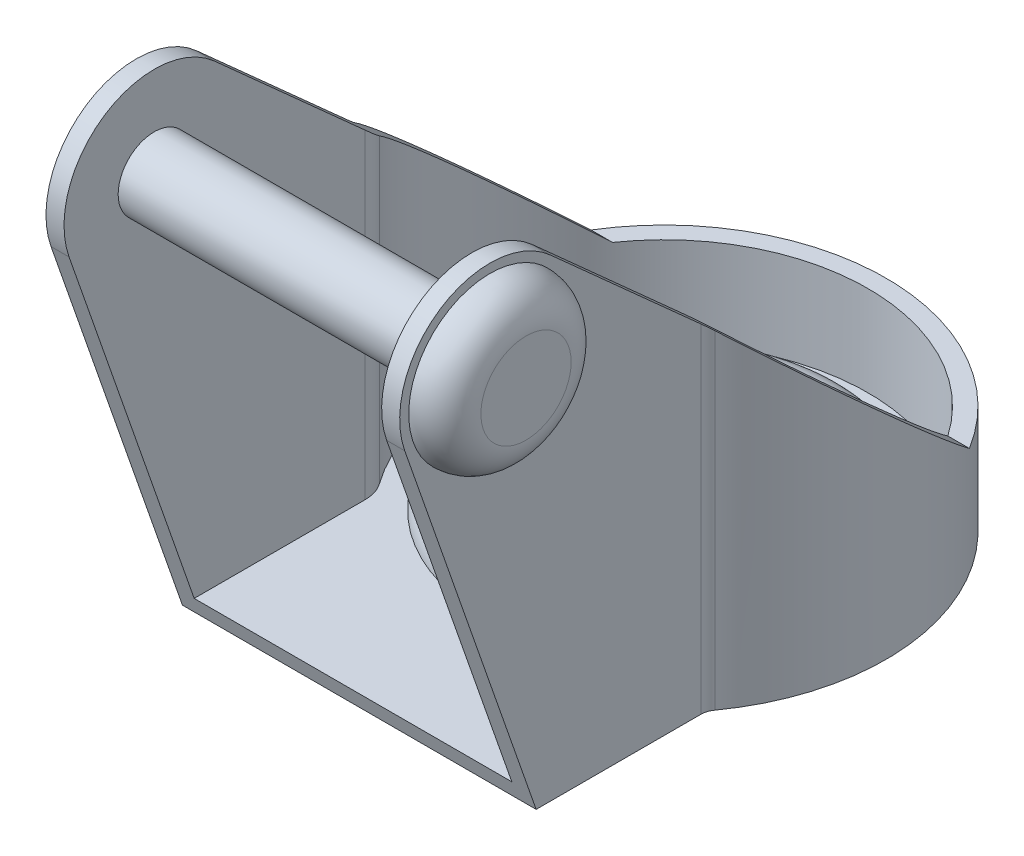
ISO-10303-21;
HEADER;
FILE_DESCRIPTION(('STEP AP214'),'2;1');
FILE_NAME('part.step','',(''),(''),'','','');
FILE_SCHEMA(('AUTOMOTIVE_DESIGN { 1 0 10303 214 1 1 1 1 }'));
ENDSEC;
DATA;
#1=APPLICATION_CONTEXT('core data for automotive mechanical design processes');
#2=APPLICATION_PROTOCOL_DEFINITION('international standard','automotive_design',2000,#1);
#3=PRODUCT_CONTEXT('',#1,'mechanical');
#4=PRODUCT('Part','Part','',(#3));
#5=PRODUCT_RELATED_PRODUCT_CATEGORY('part','',(#4));
#6=PRODUCT_DEFINITION_FORMATION('','',#4);
#7=PRODUCT_DEFINITION_CONTEXT('part definition',#1,'design');
#8=PRODUCT_DEFINITION('design','',#6,#7);
#9=PRODUCT_DEFINITION_SHAPE('','',#8);
#10=(LENGTH_UNIT() NAMED_UNIT(*) SI_UNIT(.MILLI.,.METRE.));
#11=(NAMED_UNIT(*) PLANE_ANGLE_UNIT() SI_UNIT($,.RADIAN.));
#12=(NAMED_UNIT(*) SI_UNIT($,.STERADIAN.) SOLID_ANGLE_UNIT());
#13=UNCERTAINTY_MEASURE_WITH_UNIT(LENGTH_MEASURE(1.E-05),#10,'distance_accuracy_value','');
#14=(GEOMETRIC_REPRESENTATION_CONTEXT(3) GLOBAL_UNCERTAINTY_ASSIGNED_CONTEXT((#13)) GLOBAL_UNIT_ASSIGNED_CONTEXT((#10,
#11,#12)) REPRESENTATION_CONTEXT('',''));
#15=CARTESIAN_POINT('',(0.,0.,0.));
#16=DIRECTION('',(0.,0.,1.));
#17=DIRECTION('',(1.,0.,0.));
#18=AXIS2_PLACEMENT_3D('',#15,#16,#17);
#19=CARTESIAN_POINT('',(0.,1.,0.));
#20=DIRECTION('',(0.,1.,0.));
#21=DIRECTION('',(0.,0.,1.));
#22=AXIS2_PLACEMENT_3D('',#19,#20,#21);
#23=TOROIDAL_SURFACE('',#22,8.05,2.);
#24=CARTESIAN_POINT('',(0.,1.,0.));
#25=DIRECTION('',(0.,1.,0.));
#26=DIRECTION('',(0.,0.,1.));
#27=AXIS2_PLACEMENT_3D('',#24,#25,#26);
#28=CIRCLE('',#27,10.05);
#29=CARTESIAN_POINT('',(0.,1.,10.05));
#30=VERTEX_POINT('',#29);
#31=EDGE_CURVE('E426',#30,#30,#28,.T.);
#32=ORIENTED_EDGE('',*,*,#31,.T.);
#33=EDGE_LOOP('',(#32));
#34=FACE_BOUND('',#33,.T.);
#35=CARTESIAN_POINT('',(0.,3.,0.));
#36=DIRECTION('',(0.,1.,0.));
#37=DIRECTION('',(0.,0.,1.));
#38=AXIS2_PLACEMENT_3D('',#35,#36,#37);
#39=CIRCLE('',#38,8.05);
#40=CARTESIAN_POINT('',(0.,3.,8.05));
#41=VERTEX_POINT('',#40);
#42=EDGE_CURVE('E294',#41,#41,#39,.T.);
#43=ORIENTED_EDGE('',*,*,#42,.F.);
#44=EDGE_LOOP('',(#43));
#45=FACE_BOUND('',#44,.T.);
#46=ADVANCED_FACE('F36',(#34,#45),#23,.T.);
#47=CARTESIAN_POINT('',(0.,1.,0.));
#48=DIRECTION('',(0.,1.,0.));
#49=DIRECTION('',(0.,0.,1.));
#50=AXIS2_PLACEMENT_3D('',#47,#48,#49);
#51=TOROIDAL_SURFACE('',#50,7.1,2.);
#52=CARTESIAN_POINT('',(0.,1.,0.));
#53=DIRECTION('',(0.,1.,0.));
#54=DIRECTION('',(0.,0.,1.));
#55=AXIS2_PLACEMENT_3D('',#52,#53,#54);
#56=CIRCLE('',#55,5.1);
#57=CARTESIAN_POINT('',(0.,1.,5.1));
#58=VERTEX_POINT('',#57);
#59=EDGE_CURVE('E288',#58,#58,#56,.F.);
#60=ORIENTED_EDGE('',*,*,#59,.T.);
#61=EDGE_LOOP('',(#60));
#62=FACE_BOUND('',#61,.T.);
#63=CARTESIAN_POINT('',(0.,3.,0.));
#64=DIRECTION('',(0.,1.,0.));
#65=DIRECTION('',(0.,0.,1.));
#66=AXIS2_PLACEMENT_3D('',#63,#64,#65);
#67=CIRCLE('',#66,7.1);
#68=CARTESIAN_POINT('',(0.,3.,7.1));
#69=VERTEX_POINT('',#68);
#70=EDGE_CURVE('E291',#69,#69,#67,.F.);
#71=ORIENTED_EDGE('',*,*,#70,.F.);
#72=EDGE_LOOP('',(#71));
#73=FACE_BOUND('',#72,.T.);
#74=ADVANCED_FACE('F316',(#62,#73),#51,.T.);
#75=CARTESIAN_POINT('',(0.,1.,0.));
#76=DIRECTION('',(0.,1.,0.));
#77=DIRECTION('',(0.,0.,1.));
#78=AXIS2_PLACEMENT_3D('',#75,#76,#77);
#79=PLANE('',#78);
#80=ORIENTED_EDGE('',*,*,#31,.F.);
#81=EDGE_LOOP('',(#80));
#82=FACE_BOUND('',#81,.T.);
#83=CARTESIAN_POINT('',(0.,1.,0.));
#84=DIRECTION('',(0.,-1.,0.));
#85=DIRECTION('',(0.,0.,1.));
#86=AXIS2_PLACEMENT_3D('',#83,#84,#85);
#87=CIRCLE('',#86,11.3);
#88=CARTESIAN_POINT('',(-9.17593984962406,1.,6.59485616796009));
#89=VERTEX_POINT('',#88);
#90=CARTESIAN_POINT('',(9.17593984962406,1.,6.59485616796009));
#91=VERTEX_POINT('',#90);
#92=EDGE_CURVE('E195',#89,#91,#87,.T.);
#93=ORIENTED_EDGE('',*,*,#92,.F.);
#94=CARTESIAN_POINT('',(-10.8,1.,7.76208734813001));
#95=DIRECTION('',(0.,1.,0.));
#96=DIRECTION('',(0.,0.,1.));
#97=AXIS2_PLACEMENT_3D('',#94,#95,#96);
#98=CIRCLE('',#97,2.);
#99=CARTESIAN_POINT('',(-8.8,1.,7.76208734813001));
#100=VERTEX_POINT('',#99);
#101=EDGE_CURVE('E171',#100,#89,#98,.T.);
#102=ORIENTED_EDGE('',*,*,#101,.F.);
#103=DIRECTION('',(0.,0.,-1.));
#104=VECTOR('',#103,1.);
#105=CARTESIAN_POINT('',(-8.8,1.,7.76208734813001));
#106=LINE('',#105,#104);
#107=CARTESIAN_POINT('',(-8.8,1.,17.2380214547763));
#108=VERTEX_POINT('',#107);
#109=EDGE_CURVE('E206',#108,#100,#106,.T.);
#110=ORIENTED_EDGE('',*,*,#109,.F.);
#111=DIRECTION('',(1.,0.,0.));
#112=VECTOR('',#111,1.);
#113=CARTESIAN_POINT('',(41.9681920115605,1.,17.2380214547763));
#114=LINE('',#113,#112);
#115=CARTESIAN_POINT('',(8.8,1.,17.2380214547763));
#116=VERTEX_POINT('',#115);
#117=EDGE_CURVE('E209',#108,#116,#114,.T.);
#118=ORIENTED_EDGE('',*,*,#117,.T.);
#119=DIRECTION('',(0.,0.,1.));
#120=VECTOR('',#119,1.);
#121=CARTESIAN_POINT('',(8.8,1.,29.0071349540543));
#122=LINE('',#121,#120);
#123=CARTESIAN_POINT('',(8.8,1.,7.76208734813001));
#124=VERTEX_POINT('',#123);
#125=EDGE_CURVE('E203',#124,#116,#122,.T.);
#126=ORIENTED_EDGE('',*,*,#125,.F.);
#127=CARTESIAN_POINT('',(10.8,1.,7.76208734813001));
#128=DIRECTION('',(0.,1.,0.));
#129=DIRECTION('',(0.,0.,1.));
#130=AXIS2_PLACEMENT_3D('',#127,#128,#129);
#131=CIRCLE('',#130,2.);
#132=EDGE_CURVE('E51',#91,#124,#131,.T.);
#133=ORIENTED_EDGE('',*,*,#132,.F.);
#134=EDGE_LOOP('',(#93,#102,#110,#118,#126,#133));
#135=FACE_BOUND('',#134,.T.);
#136=ADVANCED_FACE('F321',(#82,#135),#79,.T.);
#137=CARTESIAN_POINT('',(41.9681920115605,22.5,19.4516822291517));
#138=DIRECTION('',(-1.,0.,0.));
#139=DIRECTION('',(0.,0.,1.));
#140=AXIS2_PLACEMENT_3D('',#137,#138,#139);
#141=CYLINDRICAL_SURFACE('',#140,5.);
#142=DIRECTION('',(-1.,0.,0.));
#143=VECTOR('',#142,1.);
#144=CARTESIAN_POINT('',(41.9681920115605,26.2225144298288,16.1135860172794));
#145=LINE('',#144,#143);
#146=CARTESIAN_POINT('',(9.8,26.2225144298288,16.1135860172794));
#147=VERTEX_POINT('',#146);
#148=CARTESIAN_POINT('',(8.8,26.2225144298288,16.1135860172794));
#149=VERTEX_POINT('',#148);
#150=EDGE_CURVE('E241',#147,#149,#145,.T.);
#151=ORIENTED_EDGE('',*,*,#150,.T.);
#152=CARTESIAN_POINT('',(8.8,22.5,19.4516822291517));
#153=DIRECTION('',(1.,0.,0.));
#154=DIRECTION('',(0.,0.,-1.));
#155=AXIS2_PLACEMENT_3D('',#152,#153,#154);
#156=CIRCLE('',#155,5.);
#157=CARTESIAN_POINT('',(8.79999999999999,20.8512001770499,24.1720062798753));
#158=VERTEX_POINT('',#157);
#159=EDGE_CURVE('E214',#158,#149,#156,.F.);
#160=ORIENTED_EDGE('',*,*,#159,.F.);
#161=DIRECTION('',(-1.,0.,0.));
#162=VECTOR('',#161,1.);
#163=CARTESIAN_POINT('',(41.9681920115605,20.8512001770499,24.1720062798753));
#164=LINE('',#163,#162);
#165=CARTESIAN_POINT('',(9.8,20.8512001770499,24.1720062798753));
#166=VERTEX_POINT('',#165);
#167=EDGE_CURVE('E246',#166,#158,#164,.T.);
#168=ORIENTED_EDGE('',*,*,#167,.F.);
#169=CARTESIAN_POINT('',(9.8,22.5,19.4516822291517));
#170=DIRECTION('',(1.,0.,0.));
#171=DIRECTION('',(0.,0.,-1.));
#172=AXIS2_PLACEMENT_3D('',#169,#170,#171);
#173=CIRCLE('',#172,5.);
#174=EDGE_CURVE('E242',#166,#147,#173,.F.);
#175=ORIENTED_EDGE('',*,*,#174,.T.);
#176=EDGE_LOOP('',(#151,#160,#168,#175));
#177=FACE_BOUND('',#176,.T.);
#178=ADVANCED_FACE('F352',(#177),#141,.T.);
#179=CARTESIAN_POINT('',(41.9681920115605,26.2225144298288,16.1135860172794));
#180=DIRECTION('',(0.,0.744502885965768,-0.667619242374456));
#181=DIRECTION('',(0.,0.667619242374456,0.744502885965768));
#182=AXIS2_PLACEMENT_3D('',#179,#180,#181);
#183=PLANE('',#182);
#184=DIRECTION('',(0.,0.667619242374456,0.744502885965768));
#185=VECTOR('',#184,1.);
#186=CARTESIAN_POINT('',(-8.8,26.2225144298288,16.1135860172794));
#187=LINE('',#186,#185);
#188=CARTESIAN_POINT('',(-8.8,18.7334619099637,7.76208734813001));
#189=VERTEX_POINT('',#188);
#190=CARTESIAN_POINT('',(-8.8,26.2225144298288,16.1135860172794));
#191=VERTEX_POINT('',#190);
#192=EDGE_CURVE('E218',#189,#191,#187,.T.);
#193=ORIENTED_EDGE('',*,*,#192,.F.);
#194=CARTESIAN_POINT('',(-10.8,18.7334619099637,7.76208734813001));
#195=DIRECTION('',(0.,-0.744502885965767,0.667619242374457));
#196=DIRECTION('',(0.,-0.667619242374457,-0.744502885965767));
#197=AXIS2_PLACEMENT_3D('',#194,#195,#196);
#198=ELLIPSE('',#197,2.68635627571222,2.);
#199=CARTESIAN_POINT('',(-9.17593984962406,17.6867688603189,6.59485616796009));
#200=VERTEX_POINT('',#199);
#201=EDGE_CURVE('E177',#200,#189,#198,.T.);
#202=ORIENTED_EDGE('',*,*,#201,.F.);
#203=CARTESIAN_POINT('',(0.,11.7729531298255,0.));
#204=DIRECTION('',(0.,-0.744502885965767,0.667619242374457));
#205=DIRECTION('',(0.,-0.667619242374457,-0.744502885965767));
#206=AXIS2_PLACEMENT_3D('',#203,#204,#205);
#207=ELLIPSE('',#206,15.1779129577741,11.3);
#208=CARTESIAN_POINT('',(-9.28985800513682,6.00392702470085,-6.43339243668498));
#209=VERTEX_POINT('',#208);
#210=EDGE_CURVE('E176',#209,#200,#207,.F.);
#211=ORIENTED_EDGE('',*,*,#210,.F.);
#212=DIRECTION('',(1.,0.,0.));
#213=VECTOR('',#212,1.);
#214=CARTESIAN_POINT('',(-12.3,6.00392702470085,-6.43339243668498));
#215=LINE('',#214,#213);
#216=CARTESIAN_POINT('',(-10.4833898027119,6.00392702470085,-6.43339243668498));
#217=VERTEX_POINT('',#216);
#218=EDGE_CURVE('E167',#217,#209,#215,.T.);
#219=ORIENTED_EDGE('',*,*,#218,.F.);
#220=CARTESIAN_POINT('',(0.,11.7729531298255,0.));
#221=DIRECTION('',(0.,-0.744502885965767,0.667619242374457));
#222=DIRECTION('',(0.,-0.667619242374457,-0.744502885965767));
#223=AXIS2_PLACEMENT_3D('',#220,#221,#222);
#224=ELLIPSE('',#223,16.5210910956302,12.3);
#225=CARTESIAN_POINT('',(-9.98796992481203,18.2101153851413,7.17847175804505));
#226=VERTEX_POINT('',#225);
#227=EDGE_CURVE('E151',#226,#217,#224,.T.);
#228=ORIENTED_EDGE('',*,*,#227,.F.);
#229=CARTESIAN_POINT('',(-10.8,18.7334619099637,7.76208734813001));
#230=DIRECTION('',(0.,-0.744502885965767,0.667619242374457));
#231=DIRECTION('',(0.,-0.667619242374457,-0.744502885965767));
#232=AXIS2_PLACEMENT_3D('',#229,#230,#231);
#233=ELLIPSE('',#232,1.34317813785611,1.);
#234=CARTESIAN_POINT('',(-9.8,18.7334619099637,7.76208734813001));
#235=VERTEX_POINT('',#234);
#236=EDGE_CURVE('E160',#226,#235,#233,.T.);
#237=ORIENTED_EDGE('',*,*,#236,.T.);
#238=DIRECTION('',(0.,-0.667619242374457,-0.744502885965768));
#239=VECTOR('',#238,1.);
#240=CARTESIAN_POINT('',(-9.8,26.2225144298288,16.1135860172794));
#241=LINE('',#240,#239);
#242=CARTESIAN_POINT('',(-9.8,26.2225144298288,16.1135860172794));
#243=VERTEX_POINT('',#242);
#244=EDGE_CURVE('E226',#243,#235,#241,.T.);
#245=ORIENTED_EDGE('',*,*,#244,.F.);
#246=EDGE_CURVE('E245',#191,#243,#145,.T.);
#247=ORIENTED_EDGE('',*,*,#246,.F.);
#248=EDGE_LOOP('',(#193,#202,#211,#219,#228,#237,#245,#247));
#249=FACE_BOUND('',#248,.T.);
#250=ADVANCED_FACE('F174',(#249),#183,.T.);
#251=CARTESIAN_POINT('',(9.8,1.,0.));
#252=DIRECTION('',(1.,0.,0.));
#253=DIRECTION('',(0.,0.,-1.));
#254=AXIS2_PLACEMENT_3D('',#251,#252,#253);
#255=PLANE('',#254);
#256=CARTESIAN_POINT('',(9.8,22.5,19.4516822291517));
#257=DIRECTION('',(1.,0.,0.));
#258=DIRECTION('',(0.,0.,-1.));
#259=AXIS2_PLACEMENT_3D('',#256,#257,#258);
#260=CIRCLE('',#259,4.5);
#261=CARTESIAN_POINT('',(9.8,22.5,14.9516822291517));
#262=VERTEX_POINT('',#261);
#263=EDGE_CURVE('E430',#262,#262,#260,.T.);
#264=ORIENTED_EDGE('',*,*,#263,.F.);
#265=EDGE_LOOP('',(#264));
#266=FACE_BOUND('',#265,.T.);
#267=DIRECTION('',(0.,0.944064810144719,0.329759964590026));
#268=VECTOR('',#267,1.);
#269=CARTESIAN_POINT('',(9.8,0.,16.8887234393789));
#270=LINE('',#269,#268);
#271=CARTESIAN_POINT('',(9.8,0.,16.8887234393789));
#272=VERTEX_POINT('',#271);
#273=EDGE_CURVE('E229',#272,#166,#270,.T.);
#274=ORIENTED_EDGE('',*,*,#273,.F.);
#275=DIRECTION('',(0.,0.,1.));
#276=VECTOR('',#275,1.);
#277=CARTESIAN_POINT('',(9.8,0.,0.));
#278=LINE('',#277,#276);
#279=CARTESIAN_POINT('',(9.8,0.,7.76208734813001));
#280=VERTEX_POINT('',#279);
#281=EDGE_CURVE('E240',#280,#272,#278,.T.);
#282=ORIENTED_EDGE('',*,*,#281,.F.);
#283=DIRECTION('',(0.,-1.,0.));
#284=VECTOR('',#283,1.);
#285=CARTESIAN_POINT('',(9.8,1.,7.76208734813001));
#286=LINE('',#285,#284);
#287=CARTESIAN_POINT('',(9.8,18.7334619099637,7.76208734813001));
#288=VERTEX_POINT('',#287);
#289=EDGE_CURVE('E269',#288,#280,#286,.T.);
#290=ORIENTED_EDGE('',*,*,#289,.F.);
#291=DIRECTION('',(0.,-0.667619242374456,-0.744502885965768));
#292=VECTOR('',#291,1.);
#293=CARTESIAN_POINT('',(9.8,26.2225144298288,16.1135860172794));
#294=LINE('',#293,#292);
#295=EDGE_CURVE('E237',#147,#288,#294,.T.);
#296=ORIENTED_EDGE('',*,*,#295,.F.);
#297=ORIENTED_EDGE('',*,*,#174,.F.);
#298=EDGE_LOOP('',(#274,#282,#290,#296,#297));
#299=FACE_BOUND('',#298,.T.);
#300=ADVANCED_FACE('F327',(#266,#299),#255,.T.);
#301=CARTESIAN_POINT('',(10.8,1.,7.76208734813001));
#302=DIRECTION('',(0.,-1.,0.));
#303=DIRECTION('',(0.,0.,-1.));
#304=AXIS2_PLACEMENT_3D('',#301,#302,#303);
#305=CYLINDRICAL_SURFACE('',#304,1.);
#306=DIRECTION('',(0.,-1.,0.));
#307=VECTOR('',#306,1.);
#308=CARTESIAN_POINT('',(9.98796992481203,1.,7.17847175804506));
#309=LINE('',#308,#307);
#310=CARTESIAN_POINT('',(9.98796992481203,18.2101153851413,7.17847175804506));
#311=VERTEX_POINT('',#310);
#312=CARTESIAN_POINT('',(9.98796992481203,0.,7.17847175804506));
#313=VERTEX_POINT('',#312);
#314=EDGE_CURVE('E267',#311,#313,#309,.T.);
#315=ORIENTED_EDGE('',*,*,#314,.F.);
#316=CARTESIAN_POINT('',(10.8,18.7334619099637,7.76208734813001));
#317=DIRECTION('',(0.,-0.744502885965767,0.667619242374457));
#318=DIRECTION('',(0.,-0.667619242374457,-0.744502885965767));
#319=AXIS2_PLACEMENT_3D('',#316,#317,#318);
#320=ELLIPSE('',#319,1.34317813785611,1.);
#321=EDGE_CURVE('E190',#311,#288,#320,.F.);
#322=ORIENTED_EDGE('',*,*,#321,.T.);
#323=ORIENTED_EDGE('',*,*,#289,.T.);
#324=CARTESIAN_POINT('',(10.8,0.,7.76208734813001));
#325=DIRECTION('',(0.,1.,0.));
#326=DIRECTION('',(0.,0.,1.));
#327=AXIS2_PLACEMENT_3D('',#324,#325,#326);
#328=CIRCLE('',#327,1.);
#329=EDGE_CURVE('E252',#280,#313,#328,.F.);
#330=ORIENTED_EDGE('',*,*,#329,.T.);
#331=EDGE_LOOP('',(#315,#322,#323,#330));
#332=FACE_BOUND('',#331,.T.);
#333=ADVANCED_FACE('F330',(#332),#305,.F.);
#334=CARTESIAN_POINT('',(0.,1.,0.));
#335=DIRECTION('',(0.,-1.,0.));
#336=DIRECTION('',(0.,0.,-1.));
#337=AXIS2_PLACEMENT_3D('',#334,#335,#336);
#338=CYLINDRICAL_SURFACE('',#337,12.3);
#339=DIRECTION('',(0.,-1.,0.));
#340=VECTOR('',#339,1.);
#341=CARTESIAN_POINT('',(-9.98796992481203,1.,7.17847175804505));
#342=LINE('',#341,#340);
#343=CARTESIAN_POINT('',(-9.98796992481203,0.,7.17847175804505));
#344=VERTEX_POINT('',#343);
#345=EDGE_CURVE('E156',#226,#344,#342,.T.);
#346=ORIENTED_EDGE('',*,*,#345,.F.);
#347=ORIENTED_EDGE('',*,*,#227,.T.);
#348=CARTESIAN_POINT('',(0.,6.00392702470085,0.));
#349=DIRECTION('',(0.,-1.,0.));
#350=DIRECTION('',(0.,0.,-1.));
#351=AXIS2_PLACEMENT_3D('',#348,#349,#350);
#352=CIRCLE('',#351,12.3);
#353=CARTESIAN_POINT('',(10.4833898027119,6.00392702470085,-6.43339243668498));
#354=VERTEX_POINT('',#353);
#355=EDGE_CURVE('E154',#217,#354,#352,.T.);
#356=ORIENTED_EDGE('',*,*,#355,.T.);
#357=EDGE_CURVE('E162',#354,#311,#224,.T.);
#358=ORIENTED_EDGE('',*,*,#357,.T.);
#359=ORIENTED_EDGE('',*,*,#314,.T.);
#360=CARTESIAN_POINT('',(0.,0.,0.));
#361=DIRECTION('',(0.,1.,0.));
#362=DIRECTION('',(0.,0.,1.));
#363=AXIS2_PLACEMENT_3D('',#360,#361,#362);
#364=CIRCLE('',#363,12.3);
#365=EDGE_CURVE('E255',#313,#344,#364,.T.);
#366=ORIENTED_EDGE('',*,*,#365,.T.);
#367=EDGE_LOOP('',(#346,#347,#356,#358,#359,#366));
#368=FACE_BOUND('',#367,.T.);
#369=ADVANCED_FACE('F153',(#368),#338,.T.);
#370=CARTESIAN_POINT('',(-10.8,1.,7.76208734813001));
#371=DIRECTION('',(0.,-1.,0.));
#372=DIRECTION('',(0.,0.,-1.));
#373=AXIS2_PLACEMENT_3D('',#370,#371,#372);
#374=CYLINDRICAL_SURFACE('',#373,1.);
#375=ORIENTED_EDGE('',*,*,#236,.F.);
#376=ORIENTED_EDGE('',*,*,#345,.T.);
#377=CARTESIAN_POINT('',(-10.8,0.,7.76208734813001));
#378=DIRECTION('',(0.,1.,0.));
#379=DIRECTION('',(0.,0.,1.));
#380=AXIS2_PLACEMENT_3D('',#377,#378,#379);
#381=CIRCLE('',#380,1.);
#382=CARTESIAN_POINT('',(-9.8,0.,7.76208734813001));
#383=VERTEX_POINT('',#382);
#384=EDGE_CURVE('E257',#383,#344,#381,.T.);
#385=ORIENTED_EDGE('',*,*,#384,.F.);
#386=DIRECTION('',(0.,-1.,0.));
#387=VECTOR('',#386,1.);
#388=CARTESIAN_POINT('',(-9.8,1.,7.76208734813001));
#389=LINE('',#388,#387);
#390=EDGE_CURVE('E264',#235,#383,#389,.T.);
#391=ORIENTED_EDGE('',*,*,#390,.F.);
#392=EDGE_LOOP('',(#375,#376,#385,#391));
#393=FACE_BOUND('',#392,.T.);
#394=ADVANCED_FACE('F337',(#393),#374,.F.);
#395=CARTESIAN_POINT('',(-9.8,1.,0.));
#396=DIRECTION('',(1.,0.,0.));
#397=DIRECTION('',(0.,0.,-1.));
#398=AXIS2_PLACEMENT_3D('',#395,#396,#397);
#399=PLANE('',#398);
#400=CARTESIAN_POINT('',(-9.8,22.5,19.4516822291517));
#401=DIRECTION('',(1.,0.,0.));
#402=DIRECTION('',(0.,0.,-1.));
#403=AXIS2_PLACEMENT_3D('',#400,#401,#402);
#404=CIRCLE('',#403,3.55);
#405=CARTESIAN_POINT('',(-9.8,22.5,15.9016822291517));
#406=VERTEX_POINT('',#405);
#407=EDGE_CURVE('E285',#406,#406,#404,.F.);
#408=ORIENTED_EDGE('',*,*,#407,.F.);
#409=EDGE_LOOP('',(#408));
#410=FACE_BOUND('',#409,.T.);
#411=DIRECTION('',(0.,0.,1.));
#412=VECTOR('',#411,1.);
#413=CARTESIAN_POINT('',(-9.8,0.,0.));
#414=LINE('',#413,#412);
#415=CARTESIAN_POINT('',(-9.8,0.,16.8887234393789));
#416=VERTEX_POINT('',#415);
#417=EDGE_CURVE('E59',#383,#416,#414,.T.);
#418=ORIENTED_EDGE('',*,*,#417,.T.);
#419=DIRECTION('',(0.,0.944064810144719,0.329759964590026));
#420=VECTOR('',#419,1.);
#421=CARTESIAN_POINT('',(-9.8,0.,16.8887234393789));
#422=LINE('',#421,#420);
#423=CARTESIAN_POINT('',(-9.8,20.8512001770499,24.1720062798753));
#424=VERTEX_POINT('',#423);
#425=EDGE_CURVE('E225',#416,#424,#422,.T.);
#426=ORIENTED_EDGE('',*,*,#425,.T.);
#427=CARTESIAN_POINT('',(-9.8,22.5,19.4516822291517));
#428=DIRECTION('',(-1.,0.,0.));
#429=DIRECTION('',(0.,0.,1.));
#430=AXIS2_PLACEMENT_3D('',#427,#428,#429);
#431=CIRCLE('',#430,5.);
#432=EDGE_CURVE('E230',#424,#243,#431,.T.);
#433=ORIENTED_EDGE('',*,*,#432,.T.);
#434=ORIENTED_EDGE('',*,*,#244,.T.);
#435=ORIENTED_EDGE('',*,*,#390,.T.);
#436=EDGE_LOOP('',(#418,#426,#433,#434,#435));
#437=FACE_BOUND('',#436,.T.);
#438=ADVANCED_FACE('F340',(#410,#437),#399,.F.);
#439=CARTESIAN_POINT('',(0.,0.,0.));
#440=DIRECTION('',(0.,1.,0.));
#441=DIRECTION('',(0.,0.,1.));
#442=AXIS2_PLACEMENT_3D('',#439,#440,#441);
#443=PLANE('',#442);
#444=CARTESIAN_POINT('',(0.,0.,0.));
#445=DIRECTION('',(0.,1.,0.));
#446=DIRECTION('',(0.,0.,1.));
#447=AXIS2_PLACEMENT_3D('',#444,#445,#446);
#448=CIRCLE('',#447,2.6);
#449=CARTESIAN_POINT('',(0.,0.,2.6));
#450=VERTEX_POINT('',#449);
#451=EDGE_CURVE('E423',#450,#450,#448,.T.);
#452=ORIENTED_EDGE('',*,*,#451,.T.);
#453=EDGE_LOOP('',(#452));
#454=FACE_BOUND('',#453,.T.);
#455=ORIENTED_EDGE('',*,*,#329,.F.);
#456=ORIENTED_EDGE('',*,*,#281,.T.);
#457=DIRECTION('',(1.,0.,0.));
#458=VECTOR('',#457,1.);
#459=CARTESIAN_POINT('',(0.,0.,16.8887234393789));
#460=LINE('',#459,#458);
#461=EDGE_CURVE('E261',#416,#272,#460,.T.);
#462=ORIENTED_EDGE('',*,*,#461,.F.);
#463=ORIENTED_EDGE('',*,*,#417,.F.);
#464=ORIENTED_EDGE('',*,*,#384,.T.);
#465=ORIENTED_EDGE('',*,*,#365,.F.);
#466=EDGE_LOOP('',(#455,#456,#462,#463,#464,#465));
#467=FACE_BOUND('',#466,.T.);
#468=ADVANCED_FACE('F344',(#454,#467),#443,.F.);
#469=CARTESIAN_POINT('',(41.9681920115605,0.,16.8887234393789));
#470=DIRECTION('',(0.,-0.329759964590026,0.944064810144719));
#471=DIRECTION('',(0.,-0.944064810144719,-0.329759964590026));
#472=AXIS2_PLACEMENT_3D('',#469,#470,#471);
#473=PLANE('',#472);
#474=DIRECTION('',(0.,-0.944064810144719,-0.329759964590026));
#475=VECTOR('',#474,1.);
#476=CARTESIAN_POINT('',(-8.8,0.,16.8887234393789));
#477=LINE('',#476,#475);
#478=CARTESIAN_POINT('',(-8.8,20.8512001770499,24.1720062798753));
#479=VERTEX_POINT('',#478);
#480=EDGE_CURVE('E223',#479,#108,#477,.T.);
#481=ORIENTED_EDGE('',*,*,#480,.F.);
#482=EDGE_CURVE('E236',#479,#424,#164,.T.);
#483=ORIENTED_EDGE('',*,*,#482,.T.);
#484=ORIENTED_EDGE('',*,*,#425,.F.);
#485=ORIENTED_EDGE('',*,*,#461,.T.);
#486=ORIENTED_EDGE('',*,*,#273,.T.);
#487=ORIENTED_EDGE('',*,*,#167,.T.);
#488=DIRECTION('',(0.,0.944064810144719,0.329759964590026));
#489=VECTOR('',#488,1.);
#490=CARTESIAN_POINT('',(8.8,0.,16.8887234393789));
#491=LINE('',#490,#489);
#492=EDGE_CURVE('E216',#116,#158,#491,.T.);
#493=ORIENTED_EDGE('',*,*,#492,.F.);
#494=ORIENTED_EDGE('',*,*,#117,.F.);
#495=EDGE_LOOP('',(#481,#483,#484,#485,#486,#487,#493,#494));
#496=FACE_BOUND('',#495,.T.);
#497=ADVANCED_FACE('F348',(#496),#473,.T.);
#498=CARTESIAN_POINT('',(-8.8,22.5,19.4516822291517));
#499=DIRECTION('',(-1.,0.,0.));
#500=DIRECTION('',(0.,0.,1.));
#501=AXIS2_PLACEMENT_3D('',#498,#499,#500);
#502=CIRCLE('',#501,5.);
#503=EDGE_CURVE('E221',#191,#479,#502,.F.);
#504=ORIENTED_EDGE('',*,*,#503,.F.);
#505=ORIENTED_EDGE('',*,*,#246,.T.);
#506=ORIENTED_EDGE('',*,*,#432,.F.);
#507=ORIENTED_EDGE('',*,*,#482,.F.);
#508=EDGE_LOOP('',(#504,#505,#506,#507));
#509=FACE_BOUND('',#508,.T.);
#510=ADVANCED_FACE('F356',(#509),#141,.T.);
#511=DIRECTION('',(0.,-0.667619242374456,-0.744502885965768));
#512=VECTOR('',#511,1.);
#513=CARTESIAN_POINT('',(8.8,26.2225144298288,16.1135860172794));
#514=LINE('',#513,#512);
#515=CARTESIAN_POINT('',(8.8,18.7334619099637,7.76208734813001));
#516=VERTEX_POINT('',#515);
#517=EDGE_CURVE('E211',#149,#516,#514,.T.);
#518=ORIENTED_EDGE('',*,*,#517,.F.);
#519=ORIENTED_EDGE('',*,*,#150,.F.);
#520=ORIENTED_EDGE('',*,*,#295,.T.);
#521=ORIENTED_EDGE('',*,*,#321,.F.);
#522=ORIENTED_EDGE('',*,*,#357,.F.);
#523=CARTESIAN_POINT('',(9.28985800513682,6.00392702470085,-6.43339243668498));
#524=VERTEX_POINT('',#523);
#525=EDGE_CURVE('E170',#524,#354,#215,.T.);
#526=ORIENTED_EDGE('',*,*,#525,.F.);
#527=CARTESIAN_POINT('',(9.17593984962406,17.6867688603189,6.59485616796009));
#528=VERTEX_POINT('',#527);
#529=EDGE_CURVE('E187',#528,#524,#207,.F.);
#530=ORIENTED_EDGE('',*,*,#529,.F.);
#531=CARTESIAN_POINT('',(10.8,18.7334619099637,7.76208734813001));
#532=DIRECTION('',(0.,-0.744502885965767,0.667619242374457));
#533=DIRECTION('',(0.,-0.667619242374457,-0.744502885965767));
#534=AXIS2_PLACEMENT_3D('',#531,#532,#533);
#535=ELLIPSE('',#534,2.68635627571222,2.);
#536=EDGE_CURVE('E186',#516,#528,#535,.T.);
#537=ORIENTED_EDGE('',*,*,#536,.F.);
#538=EDGE_LOOP('',(#518,#519,#520,#521,#522,#526,#530,#537));
#539=FACE_BOUND('',#538,.T.);
#540=ADVANCED_FACE('F360',(#539),#183,.T.);
#541=CARTESIAN_POINT('',(-8.8,27.5,7.76208734813001));
#542=DIRECTION('',(-1.,0.,0.));
#543=DIRECTION('',(0.,0.,1.));
#544=AXIS2_PLACEMENT_3D('',#541,#542,#543);
#545=PLANE('',#544);
#546=CARTESIAN_POINT('',(-8.8,22.5,19.4516822291517));
#547=DIRECTION('',(-1.,0.,0.));
#548=DIRECTION('',(0.,0.,1.));
#549=AXIS2_PLACEMENT_3D('',#546,#547,#548);
#550=CIRCLE('',#549,2.);
#551=CARTESIAN_POINT('',(-8.8,22.5,21.4516822291517));
#552=VERTEX_POINT('',#551);
#553=EDGE_CURVE('E282',#552,#552,#550,.F.);
#554=ORIENTED_EDGE('',*,*,#553,.F.);
#555=EDGE_LOOP('',(#554));
#556=FACE_BOUND('',#555,.T.);
#557=ORIENTED_EDGE('',*,*,#480,.T.);
#558=ORIENTED_EDGE('',*,*,#109,.T.);
#559=DIRECTION('',(0.,1.,0.));
#560=VECTOR('',#559,1.);
#561=CARTESIAN_POINT('',(-8.8,18.7334619099637,7.76208734813002));
#562=LINE('',#561,#560);
#563=EDGE_CURVE('E274',#100,#189,#562,.T.);
#564=ORIENTED_EDGE('',*,*,#563,.T.);
#565=ORIENTED_EDGE('',*,*,#192,.T.);
#566=ORIENTED_EDGE('',*,*,#503,.T.);
#567=EDGE_LOOP('',(#557,#558,#564,#565,#566));
#568=FACE_BOUND('',#567,.T.);
#569=ADVANCED_FACE('F364',(#556,#568),#545,.F.);
#570=CARTESIAN_POINT('',(8.8,27.5,29.0071349540543));
#571=DIRECTION('',(1.,0.,0.));
#572=DIRECTION('',(0.,0.,-1.));
#573=AXIS2_PLACEMENT_3D('',#570,#571,#572);
#574=PLANE('',#573);
#575=CARTESIAN_POINT('',(8.8,22.5,19.4516822291517));
#576=DIRECTION('',(1.,0.,0.));
#577=DIRECTION('',(0.,0.,-1.));
#578=AXIS2_PLACEMENT_3D('',#575,#576,#577);
#579=CIRCLE('',#578,2.);
#580=CARTESIAN_POINT('',(8.8,22.5,17.4516822291517));
#581=VERTEX_POINT('',#580);
#582=EDGE_CURVE('E279',#581,#581,#579,.F.);
#583=ORIENTED_EDGE('',*,*,#582,.F.);
#584=EDGE_LOOP('',(#583));
#585=FACE_BOUND('',#584,.T.);
#586=ORIENTED_EDGE('',*,*,#492,.T.);
#587=ORIENTED_EDGE('',*,*,#159,.T.);
#588=ORIENTED_EDGE('',*,*,#517,.T.);
#589=DIRECTION('',(0.,-1.,0.));
#590=VECTOR('',#589,1.);
#591=CARTESIAN_POINT('',(8.8,18.7334619099637,7.76208734813002));
#592=LINE('',#591,#590);
#593=EDGE_CURVE('E271',#516,#124,#592,.T.);
#594=ORIENTED_EDGE('',*,*,#593,.T.);
#595=ORIENTED_EDGE('',*,*,#125,.T.);
#596=EDGE_LOOP('',(#586,#587,#588,#594,#595));
#597=FACE_BOUND('',#596,.T.);
#598=ADVANCED_FACE('F366',(#585,#597),#574,.F.);
#599=CARTESIAN_POINT('',(-10.8,31.,7.76208734813001));
#600=DIRECTION('',(0.,-1.,0.));
#601=DIRECTION('',(0.,0.,-1.));
#602=AXIS2_PLACEMENT_3D('',#599,#600,#601);
#603=CYLINDRICAL_SURFACE('',#602,2.);
#604=DIRECTION('',(0.,-1.,0.));
#605=VECTOR('',#604,1.);
#606=CARTESIAN_POINT('',(-9.17593984962406,31.,6.59485616796009));
#607=LINE('',#606,#605);
#608=EDGE_CURVE('E201',#200,#89,#607,.T.);
#609=ORIENTED_EDGE('',*,*,#608,.F.);
#610=ORIENTED_EDGE('',*,*,#201,.T.);
#611=ORIENTED_EDGE('',*,*,#563,.F.);
#612=ORIENTED_EDGE('',*,*,#101,.T.);
#613=EDGE_LOOP('',(#609,#610,#611,#612));
#614=FACE_BOUND('',#613,.T.);
#615=ADVANCED_FACE('F369',(#614),#603,.T.);
#616=CARTESIAN_POINT('',(0.,31.,0.));
#617=DIRECTION('',(0.,-1.,0.));
#618=DIRECTION('',(0.,0.,-1.));
#619=AXIS2_PLACEMENT_3D('',#616,#617,#618);
#620=CYLINDRICAL_SURFACE('',#619,11.3);
#621=CARTESIAN_POINT('',(0.,6.00392702470084,0.));
#622=DIRECTION('',(0.,-1.,0.));
#623=DIRECTION('',(0.,0.,-1.));
#624=AXIS2_PLACEMENT_3D('',#621,#622,#623);
#625=CIRCLE('',#624,11.3);
#626=EDGE_CURVE('E277',#524,#209,#625,.F.);
#627=ORIENTED_EDGE('',*,*,#626,.T.);
#628=ORIENTED_EDGE('',*,*,#210,.T.);
#629=ORIENTED_EDGE('',*,*,#608,.T.);
#630=ORIENTED_EDGE('',*,*,#92,.T.);
#631=DIRECTION('',(0.,-1.,0.));
#632=VECTOR('',#631,1.);
#633=CARTESIAN_POINT('',(9.17593984962406,31.,6.59485616796009));
#634=LINE('',#633,#632);
#635=EDGE_CURVE('E199',#528,#91,#634,.T.);
#636=ORIENTED_EDGE('',*,*,#635,.F.);
#637=ORIENTED_EDGE('',*,*,#529,.T.);
#638=EDGE_LOOP('',(#627,#628,#629,#630,#636,#637));
#639=FACE_BOUND('',#638,.T.);
#640=ADVANCED_FACE('F376',(#639),#620,.F.);
#641=CARTESIAN_POINT('',(10.8,31.,7.76208734813001));
#642=DIRECTION('',(0.,-1.,0.));
#643=DIRECTION('',(0.,0.,-1.));
#644=AXIS2_PLACEMENT_3D('',#641,#642,#643);
#645=CYLINDRICAL_SURFACE('',#644,2.);
#646=ORIENTED_EDGE('',*,*,#593,.F.);
#647=ORIENTED_EDGE('',*,*,#536,.T.);
#648=ORIENTED_EDGE('',*,*,#635,.T.);
#649=ORIENTED_EDGE('',*,*,#132,.T.);
#650=EDGE_LOOP('',(#646,#647,#648,#649));
#651=FACE_BOUND('',#650,.T.);
#652=ADVANCED_FACE('F380',(#651),#645,.T.);
#653=CARTESIAN_POINT('',(-12.3,6.00392702470085,-6.43339243668498));
#654=DIRECTION('',(0.,-1.,0.));
#655=DIRECTION('',(0.,0.,-1.));
#656=AXIS2_PLACEMENT_3D('',#653,#654,#655);
#657=PLANE('',#656);
#658=ORIENTED_EDGE('',*,*,#218,.T.);
#659=ORIENTED_EDGE('',*,*,#626,.F.);
#660=ORIENTED_EDGE('',*,*,#525,.T.);
#661=ORIENTED_EDGE('',*,*,#355,.F.);
#662=EDGE_LOOP('',(#658,#659,#660,#661));
#663=FACE_BOUND('',#662,.T.);
#664=ADVANCED_FACE('F166',(#663),#657,.F.);
#665=CARTESIAN_POINT('',(14.4568542494924,22.5,19.4516822291517));
#666=DIRECTION('',(-1.,0.,0.));
#667=DIRECTION('',(0.,0.,1.));
#668=AXIS2_PLACEMENT_3D('',#665,#666,#667);
#669=CYLINDRICAL_SURFACE('',#668,2.);
#670=ORIENTED_EDGE('',*,*,#553,.T.);
#671=EDGE_LOOP('',(#670));
#672=FACE_BOUND('',#671,.T.);
#673=ORIENTED_EDGE('',*,*,#582,.T.);
#674=EDGE_LOOP('',(#673));
#675=FACE_BOUND('',#674,.T.);
#676=ADVANCED_FACE('F386',(#672,#675),#669,.T.);
#677=CARTESIAN_POINT('',(-10.8,22.5,19.4516822291517));
#678=DIRECTION('',(-1.,0.,0.));
#679=DIRECTION('',(0.,0.,1.));
#680=AXIS2_PLACEMENT_3D('',#677,#678,#679);
#681=PLANE('',#680);
#682=CARTESIAN_POINT('',(-10.8,22.5,19.4516822291517));
#683=DIRECTION('',(-1.,0.,0.));
#684=DIRECTION('',(0.,0.,1.));
#685=AXIS2_PLACEMENT_3D('',#682,#683,#684);
#686=CIRCLE('',#685,1.81794919243112);
#687=CARTESIAN_POINT('',(-10.8,22.5,21.2696314215828));
#688=VERTEX_POINT('',#687);
#689=EDGE_CURVE('E44',#688,#688,#686,.T.);
#690=ORIENTED_EDGE('',*,*,#689,.T.);
#691=EDGE_LOOP('',(#690));
#692=FACE_BOUND('',#691,.T.);
#693=CARTESIAN_POINT('',(-10.8,22.5,19.4516822291517));
#694=DIRECTION('',(-1.,0.,0.));
#695=DIRECTION('',(0.,0.,1.));
#696=AXIS2_PLACEMENT_3D('',#693,#694,#695);
#697=CIRCLE('',#696,1.8);
#698=CARTESIAN_POINT('',(-10.8,22.5,21.2516822291517));
#699=VERTEX_POINT('',#698);
#700=EDGE_CURVE('E182',#699,#699,#697,.T.);
#701=ORIENTED_EDGE('',*,*,#700,.F.);
#702=EDGE_LOOP('',(#701));
#703=FACE_BOUND('',#702,.T.);
#704=ADVANCED_FACE('F299',(#692,#703),#681,.T.);
#705=CARTESIAN_POINT('',(-8.8,22.5,19.4516822291517));
#706=DIRECTION('',(-1.,0.,0.));
#707=DIRECTION('',(0.,0.,1.));
#708=AXIS2_PLACEMENT_3D('',#705,#706,#707);
#709=CYLINDRICAL_SURFACE('',#708,1.8);
#710=CARTESIAN_POINT('',(-8.8,22.5,19.4516822291517));
#711=DIRECTION('',(-1.,0.,0.));
#712=DIRECTION('',(0.,0.,1.));
#713=AXIS2_PLACEMENT_3D('',#710,#711,#712);
#714=CIRCLE('',#713,1.8);
#715=CARTESIAN_POINT('',(-8.8,22.5,21.2516822291517));
#716=VERTEX_POINT('',#715);
#717=EDGE_CURVE('E180',#716,#716,#714,.T.);
#718=ORIENTED_EDGE('',*,*,#717,.F.);
#719=EDGE_LOOP('',(#718));
#720=FACE_BOUND('',#719,.T.);
#721=ORIENTED_EDGE('',*,*,#700,.T.);
#722=EDGE_LOOP('',(#721));
#723=FACE_BOUND('',#722,.T.);
#724=ADVANCED_FACE('F392',(#720,#723),#709,.F.);
#725=CARTESIAN_POINT('',(-8.8,22.5,19.4516822291517));
#726=DIRECTION('',(-1.,0.,0.));
#727=DIRECTION('',(0.,0.,1.));
#728=AXIS2_PLACEMENT_3D('',#725,#726,#727);
#729=PLANE('',#728);
#730=ORIENTED_EDGE('',*,*,#717,.T.);
#731=EDGE_LOOP('',(#730));
#732=FACE_BOUND('',#731,.T.);
#733=ADVANCED_FACE('F395',(#732),#729,.T.);
#734=CARTESIAN_POINT('',(11.8,22.5,19.4516822291517));
#735=DIRECTION('',(1.,0.,0.));
#736=DIRECTION('',(0.,0.,-1.));
#737=AXIS2_PLACEMENT_3D('',#734,#735,#736);
#738=PLANE('',#737);
#739=CARTESIAN_POINT('',(11.8,22.5,19.4516822291517));
#740=DIRECTION('',(1.,0.,0.));
#741=DIRECTION('',(0.,0.,-1.));
#742=AXIS2_PLACEMENT_3D('',#739,#740,#741);
#743=CIRCLE('',#742,2.5);
#744=CARTESIAN_POINT('',(11.8,22.5,16.9516822291517));
#745=VERTEX_POINT('',#744);
#746=EDGE_CURVE('E11',#745,#745,#743,.T.);
#747=ORIENTED_EDGE('',*,*,#746,.T.);
#748=EDGE_LOOP('',(#747));
#749=FACE_BOUND('',#748,.T.);
#750=ADVANCED_FACE('F399',(#749),#738,.T.);
#751=CARTESIAN_POINT('',(0.,3.,0.));
#752=DIRECTION('',(0.,1.,0.));
#753=DIRECTION('',(0.,0.,1.));
#754=AXIS2_PLACEMENT_3D('',#751,#752,#753);
#755=PLANE('',#754);
#756=ORIENTED_EDGE('',*,*,#42,.T.);
#757=EDGE_LOOP('',(#756));
#758=FACE_BOUND('',#757,.T.);
#759=ORIENTED_EDGE('',*,*,#70,.T.);
#760=EDGE_LOOP('',(#759));
#761=FACE_BOUND('',#760,.T.);
#762=ADVANCED_FACE('F403',(#758,#761),#755,.T.);
#763=CARTESIAN_POINT('',(0.,1.,0.));
#764=DIRECTION('',(0.,1.,0.));
#765=DIRECTION('',(0.,0.,1.));
#766=AXIS2_PLACEMENT_3D('',#763,#764,#765);
#767=CIRCLE('',#766,2.6);
#768=CARTESIAN_POINT('',(0.,1.,2.6));
#769=VERTEX_POINT('',#768);
#770=EDGE_CURVE('E420',#769,#769,#767,.T.);
#771=ORIENTED_EDGE('',*,*,#770,.F.);
#772=EDGE_LOOP('',(#771));
#773=FACE_BOUND('',#772,.T.);
#774=ORIENTED_EDGE('',*,*,#59,.F.);
#775=EDGE_LOOP('',(#774));
#776=FACE_BOUND('',#775,.T.);
#777=ADVANCED_FACE('F311',(#773,#776),#79,.T.);
#778=CARTESIAN_POINT('',(0.,0.,0.));
#779=DIRECTION('',(0.,1.,0.));
#780=DIRECTION('',(0.,0.,1.));
#781=AXIS2_PLACEMENT_3D('',#778,#779,#780);
#782=CYLINDRICAL_SURFACE('',#781,2.6);
#783=ORIENTED_EDGE('',*,*,#451,.F.);
#784=EDGE_LOOP('',(#783));
#785=FACE_BOUND('',#784,.T.);
#786=ORIENTED_EDGE('',*,*,#770,.T.);
#787=EDGE_LOOP('',(#786));
#788=FACE_BOUND('',#787,.T.);
#789=ADVANCED_FACE('F304',(#785,#788),#782,.F.);
#790=CARTESIAN_POINT('',(-8.8,22.5,19.4516822291517));
#791=DIRECTION('',(1.,0.,0.));
#792=DIRECTION('',(0.,0.,-1.));
#793=AXIS2_PLACEMENT_3D('',#790,#791,#792);
#794=DEGENERATE_TOROIDAL_SURFACE('',#793,1.81794919243112,2.,.T.);
#795=ORIENTED_EDGE('',*,*,#407,.T.);
#796=EDGE_LOOP('',(#795));
#797=FACE_BOUND('',#796,.T.);
#798=ORIENTED_EDGE('',*,*,#689,.F.);
#799=EDGE_LOOP('',(#798));
#800=FACE_BOUND('',#799,.T.);
#801=ADVANCED_FACE('F302',(#797,#800),#794,.T.);
#802=CARTESIAN_POINT('',(9.8,22.5,19.4516822291517));
#803=DIRECTION('',(1.,0.,0.));
#804=DIRECTION('',(0.,0.,-1.));
#805=AXIS2_PLACEMENT_3D('',#802,#803,#804);
#806=TOROIDAL_SURFACE('',#805,2.5,2.);
#807=ORIENTED_EDGE('',*,*,#263,.T.);
#808=EDGE_LOOP('',(#807));
#809=FACE_BOUND('',#808,.T.);
#810=ORIENTED_EDGE('',*,*,#746,.F.);
#811=EDGE_LOOP('',(#810));
#812=FACE_BOUND('',#811,.T.);
#813=ADVANCED_FACE('F38',(#809,#812),#806,.T.);
#814=CLOSED_SHELL('',(#46,#74,#136,#178,#250,#300,#333,#369,#394,#438,#468,#497,#510,#540,#569,
#598,#615,#640,#652,#664,#676,#704,#724,#733,#750,#762,#777,#789,#801,#813));
#815=MANIFOLD_SOLID_BREP('B2',#814);
#816=ADVANCED_BREP_SHAPE_REPRESENTATION('',(#18,#815),#14);
#817=SHAPE_DEFINITION_REPRESENTATION(#9,#816);
ENDSEC;
END-ISO-10303-21;
